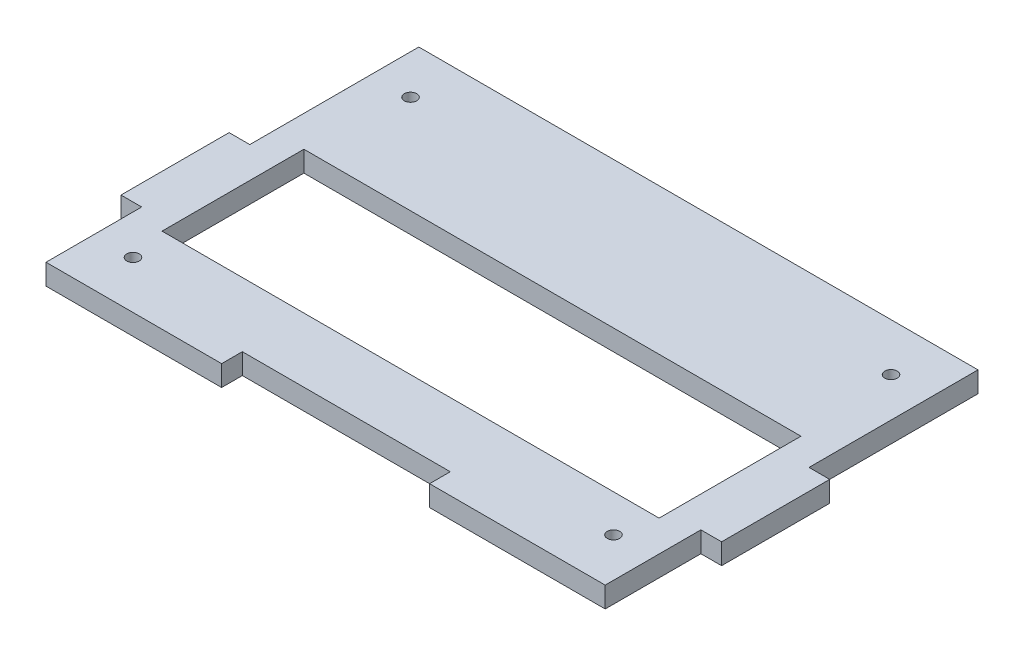
ISO-10303-21;
HEADER;
FILE_DESCRIPTION(('STEP AP214'),'2;1');
FILE_NAME('part.step','',(''),(''),'','','');
FILE_SCHEMA(('AUTOMOTIVE_DESIGN { 1 0 10303 214 1 1 1 1 }'));
ENDSEC;
DATA;
#1=APPLICATION_CONTEXT('core data for automotive mechanical design processes');
#2=APPLICATION_PROTOCOL_DEFINITION('international standard','automotive_design',2000,#1);
#3=PRODUCT_CONTEXT('',#1,'mechanical');
#4=PRODUCT('Part','Part','',(#3));
#5=PRODUCT_RELATED_PRODUCT_CATEGORY('part','',(#4));
#6=PRODUCT_DEFINITION_FORMATION('','',#4);
#7=PRODUCT_DEFINITION_CONTEXT('part definition',#1,'design');
#8=PRODUCT_DEFINITION('design','',#6,#7);
#9=PRODUCT_DEFINITION_SHAPE('','',#8);
#10=(LENGTH_UNIT() NAMED_UNIT(*) SI_UNIT(.MILLI.,.METRE.));
#11=(NAMED_UNIT(*) PLANE_ANGLE_UNIT() SI_UNIT($,.RADIAN.));
#12=(NAMED_UNIT(*) SI_UNIT($,.STERADIAN.) SOLID_ANGLE_UNIT());
#13=UNCERTAINTY_MEASURE_WITH_UNIT(LENGTH_MEASURE(1.E-05),#10,'distance_accuracy_value','');
#14=(GEOMETRIC_REPRESENTATION_CONTEXT(3) GLOBAL_UNCERTAINTY_ASSIGNED_CONTEXT((#13)) GLOBAL_UNIT_ASSIGNED_CONTEXT((#10,
#11,#12)) REPRESENTATION_CONTEXT('',''));
#15=CARTESIAN_POINT('',(0.,0.,0.));
#16=DIRECTION('',(0.,0.,1.));
#17=DIRECTION('',(1.,0.,0.));
#18=AXIS2_PLACEMENT_3D('',#15,#16,#17);
#19=CARTESIAN_POINT('',(-72.5,5.,45.));
#20=DIRECTION('',(0.,0.,-1.));
#21=DIRECTION('',(-1.,0.,0.));
#22=AXIS2_PLACEMENT_3D('',#19,#20,#21);
#23=PLANE('',#22);
#24=DIRECTION('',(0.,1.,0.));
#25=VECTOR('',#24,1.);
#26=CARTESIAN_POINT('',(25.1,0.,45.));
#27=LINE('',#26,#25);
#28=CARTESIAN_POINT('',(25.1,0.,45.));
#29=VERTEX_POINT('',#28);
#30=CARTESIAN_POINT('',(25.1,5.,45.));
#31=VERTEX_POINT('',#30);
#32=EDGE_CURVE('E209',#29,#31,#27,.T.);
#33=ORIENTED_EDGE('',*,*,#32,.F.);
#34=DIRECTION('',(1.,0.,0.));
#35=VECTOR('',#34,1.);
#36=CARTESIAN_POINT('',(-72.5,0.,45.));
#37=LINE('',#36,#35);
#38=CARTESIAN_POINT('',(67.5,0.,45.));
#39=VERTEX_POINT('',#38);
#40=EDGE_CURVE('E196',#29,#39,#37,.T.);
#41=ORIENTED_EDGE('',*,*,#40,.T.);
#42=DIRECTION('',(0.,1.,0.));
#43=VECTOR('',#42,1.);
#44=CARTESIAN_POINT('',(67.5,0.,45.));
#45=LINE('',#44,#43);
#46=CARTESIAN_POINT('',(67.5,5.,45.));
#47=VERTEX_POINT('',#46);
#48=EDGE_CURVE('E242',#39,#47,#45,.T.);
#49=ORIENTED_EDGE('',*,*,#48,.T.);
#50=DIRECTION('',(1.,0.,0.));
#51=VECTOR('',#50,1.);
#52=CARTESIAN_POINT('',(-72.5,5.,45.));
#53=LINE('',#52,#51);
#54=EDGE_CURVE('E48',#31,#47,#53,.T.);
#55=ORIENTED_EDGE('',*,*,#54,.F.);
#56=EDGE_LOOP('',(#33,#41,#49,#55));
#57=FACE_BOUND('',#56,.T.);
#58=ADVANCED_FACE('F39',(#57),#23,.F.);
#59=CARTESIAN_POINT('',(0.,5.,0.));
#60=DIRECTION('',(0.,-1.,0.));
#61=DIRECTION('',(0.,0.,-1.));
#62=AXIS2_PLACEMENT_3D('',#59,#60,#61);
#63=PLANE('',#62);
#64=CARTESIAN_POINT('',(-58.,5.,33.5));
#65=DIRECTION('',(0.,1.,0.));
#66=DIRECTION('',(0.,0.,1.));
#67=AXIS2_PLACEMENT_3D('',#64,#65,#66);
#68=CIRCLE('',#67,1.5);
#69=CARTESIAN_POINT('',(-58.,5.,35.));
#70=VERTEX_POINT('',#69);
#71=EDGE_CURVE('E644',#70,#70,#68,.T.);
#72=ORIENTED_EDGE('',*,*,#71,.F.);
#73=EDGE_LOOP('',(#72));
#74=FACE_BOUND('',#73,.T.);
#75=CARTESIAN_POINT('',(58.,5.,33.5));
#76=DIRECTION('',(0.,1.,0.));
#77=DIRECTION('',(0.,0.,1.));
#78=AXIS2_PLACEMENT_3D('',#75,#76,#77);
#79=CIRCLE('',#78,1.5);
#80=CARTESIAN_POINT('',(58.,5.,35.));
#81=VERTEX_POINT('',#80);
#82=EDGE_CURVE('E643',#81,#81,#79,.T.);
#83=ORIENTED_EDGE('',*,*,#82,.F.);
#84=EDGE_LOOP('',(#83));
#85=FACE_BOUND('',#84,.T.);
#86=CARTESIAN_POINT('',(58.,5.,-33.5));
#87=DIRECTION('',(0.,1.,0.));
#88=DIRECTION('',(0.,0.,1.));
#89=AXIS2_PLACEMENT_3D('',#86,#87,#88);
#90=CIRCLE('',#89,1.5);
#91=CARTESIAN_POINT('',(58.,5.,-32.));
#92=VERTEX_POINT('',#91);
#93=EDGE_CURVE('E641',#92,#92,#90,.T.);
#94=ORIENTED_EDGE('',*,*,#93,.F.);
#95=EDGE_LOOP('',(#94));
#96=FACE_BOUND('',#95,.T.);
#97=CARTESIAN_POINT('',(-58.,5.,-33.5));
#98=DIRECTION('',(0.,1.,0.));
#99=DIRECTION('',(0.,0.,1.));
#100=AXIS2_PLACEMENT_3D('',#97,#98,#99);
#101=CIRCLE('',#100,1.5);
#102=CARTESIAN_POINT('',(-58.,5.,-32.));
#103=VERTEX_POINT('',#102);
#104=EDGE_CURVE('E204',#103,#103,#101,.T.);
#105=ORIENTED_EDGE('',*,*,#104,.F.);
#106=EDGE_LOOP('',(#105));
#107=FACE_BOUND('',#106,.T.);
#108=DIRECTION('',(-1.,0.,0.));
#109=VECTOR('',#108,1.);
#110=CARTESIAN_POINT('',(-60.,5.,-9.76000000000001));
#111=LINE('',#110,#109);
#112=CARTESIAN_POINT('',(60.,5.,-9.76000000000001));
#113=VERTEX_POINT('',#112);
#114=CARTESIAN_POINT('',(-60.,5.,-9.76000000000001));
#115=VERTEX_POINT('',#114);
#116=EDGE_CURVE('E301',#113,#115,#111,.T.);
#117=ORIENTED_EDGE('',*,*,#116,.F.);
#118=DIRECTION('',(0.,0.,-1.));
#119=VECTOR('',#118,1.);
#120=CARTESIAN_POINT('',(60.,5.,24.49));
#121=LINE('',#120,#119);
#122=CARTESIAN_POINT('',(60.,5.,24.49));
#123=VERTEX_POINT('',#122);
#124=EDGE_CURVE('E284',#123,#113,#121,.T.);
#125=ORIENTED_EDGE('',*,*,#124,.F.);
#126=DIRECTION('',(1.,0.,0.));
#127=VECTOR('',#126,1.);
#128=CARTESIAN_POINT('',(-60.,5.,24.49));
#129=LINE('',#128,#127);
#130=CARTESIAN_POINT('',(-60.,5.,24.49));
#131=VERTEX_POINT('',#130);
#132=EDGE_CURVE('E292',#131,#123,#129,.T.);
#133=ORIENTED_EDGE('',*,*,#132,.F.);
#134=DIRECTION('',(0.,0.,1.));
#135=VECTOR('',#134,1.);
#136=CARTESIAN_POINT('',(-60.,5.,24.49));
#137=LINE('',#136,#135);
#138=EDGE_CURVE('E302',#115,#131,#137,.T.);
#139=ORIENTED_EDGE('',*,*,#138,.F.);
#140=EDGE_LOOP('',(#117,#125,#133,#139));
#141=FACE_BOUND('',#140,.T.);
#142=DIRECTION('',(0.,0.,-1.));
#143=VECTOR('',#142,1.);
#144=CARTESIAN_POINT('',(25.1,5.,40.));
#145=LINE('',#144,#143);
#146=CARTESIAN_POINT('',(25.1,5.,40.));
#147=VERTEX_POINT('',#146);
#148=EDGE_CURVE('E184',#31,#147,#145,.T.);
#149=ORIENTED_EDGE('',*,*,#148,.F.);
#150=ORIENTED_EDGE('',*,*,#54,.T.);
#151=DIRECTION('',(0.,0.,1.));
#152=VECTOR('',#151,1.);
#153=CARTESIAN_POINT('',(67.5,5.,45.));
#154=LINE('',#153,#152);
#155=CARTESIAN_POINT('',(67.5,5.,21.9));
#156=VERTEX_POINT('',#155);
#157=EDGE_CURVE('E249',#156,#47,#154,.T.);
#158=ORIENTED_EDGE('',*,*,#157,.F.);
#159=DIRECTION('',(-1.,0.,0.));
#160=VECTOR('',#159,1.);
#161=CARTESIAN_POINT('',(72.5,5.,21.9));
#162=LINE('',#161,#160);
#163=CARTESIAN_POINT('',(72.5,5.,21.9));
#164=VERTEX_POINT('',#163);
#165=EDGE_CURVE('E223',#164,#156,#162,.T.);
#166=ORIENTED_EDGE('',*,*,#165,.F.);
#167=DIRECTION('',(0.,0.,-1.));
#168=VECTOR('',#167,1.);
#169=CARTESIAN_POINT('',(72.5,5.,45.));
#170=LINE('',#169,#168);
#171=CARTESIAN_POINT('',(72.5,5.,-4.2));
#172=VERTEX_POINT('',#171);
#173=EDGE_CURVE('E317',#164,#172,#170,.T.);
#174=ORIENTED_EDGE('',*,*,#173,.T.);
#175=DIRECTION('',(1.,0.,0.));
#176=VECTOR('',#175,1.);
#177=CARTESIAN_POINT('',(72.5,5.,-4.2));
#178=LINE('',#177,#176);
#179=CARTESIAN_POINT('',(67.5,5.,-4.2));
#180=VERTEX_POINT('',#179);
#181=EDGE_CURVE('E261',#180,#172,#178,.T.);
#182=ORIENTED_EDGE('',*,*,#181,.F.);
#183=DIRECTION('',(0.,0.,1.));
#184=VECTOR('',#183,1.);
#185=CARTESIAN_POINT('',(67.5,5.,-45.));
#186=LINE('',#185,#184);
#187=CARTESIAN_POINT('',(67.5,5.,-45.));
#188=VERTEX_POINT('',#187);
#189=EDGE_CURVE('E245',#188,#180,#186,.T.);
#190=ORIENTED_EDGE('',*,*,#189,.F.);
#191=DIRECTION('',(-1.,0.,0.));
#192=VECTOR('',#191,1.);
#193=CARTESIAN_POINT('',(-72.5,5.,-45.));
#194=LINE('',#193,#192);
#195=CARTESIAN_POINT('',(-67.5,5.,-45.));
#196=VERTEX_POINT('',#195);
#197=EDGE_CURVE('E325',#188,#196,#194,.T.);
#198=ORIENTED_EDGE('',*,*,#197,.T.);
#199=DIRECTION('',(0.,0.,-1.));
#200=VECTOR('',#199,1.);
#201=CARTESIAN_POINT('',(-67.5,5.,-45.));
#202=LINE('',#201,#200);
#203=CARTESIAN_POINT('',(-67.5,5.,-4.2));
#204=VERTEX_POINT('',#203);
#205=EDGE_CURVE('E272',#204,#196,#202,.T.);
#206=ORIENTED_EDGE('',*,*,#205,.F.);
#207=DIRECTION('',(1.,0.,0.));
#208=VECTOR('',#207,1.);
#209=CARTESIAN_POINT('',(-72.5,5.,-4.2));
#210=LINE('',#209,#208);
#211=CARTESIAN_POINT('',(-72.5,5.,-4.2));
#212=VERTEX_POINT('',#211);
#213=EDGE_CURVE('E231',#212,#204,#210,.T.);
#214=ORIENTED_EDGE('',*,*,#213,.F.);
#215=DIRECTION('',(0.,0.,1.));
#216=VECTOR('',#215,1.);
#217=CARTESIAN_POINT('',(-72.5,5.,45.));
#218=LINE('',#217,#216);
#219=CARTESIAN_POINT('',(-72.5,5.,21.9));
#220=VERTEX_POINT('',#219);
#221=EDGE_CURVE('E326',#212,#220,#218,.T.);
#222=ORIENTED_EDGE('',*,*,#221,.T.);
#223=DIRECTION('',(-1.,0.,0.));
#224=VECTOR('',#223,1.);
#225=CARTESIAN_POINT('',(-72.5,5.,21.9));
#226=LINE('',#225,#224);
#227=CARTESIAN_POINT('',(-67.5,5.,21.9));
#228=VERTEX_POINT('',#227);
#229=EDGE_CURVE('E226',#228,#220,#226,.T.);
#230=ORIENTED_EDGE('',*,*,#229,.F.);
#231=DIRECTION('',(0.,0.,-1.));
#232=VECTOR('',#231,1.);
#233=CARTESIAN_POINT('',(-67.5,5.,45.));
#234=LINE('',#233,#232);
#235=CARTESIAN_POINT('',(-67.5,5.,45.));
#236=VERTEX_POINT('',#235);
#237=EDGE_CURVE('E229',#236,#228,#234,.T.);
#238=ORIENTED_EDGE('',*,*,#237,.F.);
#239=CARTESIAN_POINT('',(-25.1,5.,45.));
#240=VERTEX_POINT('',#239);
#241=EDGE_CURVE('E11',#236,#240,#53,.T.);
#242=ORIENTED_EDGE('',*,*,#241,.T.);
#243=DIRECTION('',(0.,0.,1.));
#244=VECTOR('',#243,1.);
#245=CARTESIAN_POINT('',(-25.1,5.,40.));
#246=LINE('',#245,#244);
#247=CARTESIAN_POINT('',(-25.1,5.,40.));
#248=VERTEX_POINT('',#247);
#249=EDGE_CURVE('E200',#248,#240,#246,.T.);
#250=ORIENTED_EDGE('',*,*,#249,.F.);
#251=DIRECTION('',(-1.,0.,0.));
#252=VECTOR('',#251,1.);
#253=CARTESIAN_POINT('',(-25.1,5.,40.));
#254=LINE('',#253,#252);
#255=EDGE_CURVE('E203',#147,#248,#254,.T.);
#256=ORIENTED_EDGE('',*,*,#255,.F.);
#257=EDGE_LOOP('',(#149,#150,#158,#166,#174,#182,#190,#198,#206,#214,#222,#230,#238,#242,#250,#256));
#258=FACE_BOUND('',#257,.T.);
#259=ADVANCED_FACE('F359',(#74,#85,#96,#107,#141,#258),#63,.F.);
#260=CARTESIAN_POINT('',(0.,0.,0.));
#261=DIRECTION('',(0.,-1.,0.));
#262=DIRECTION('',(0.,0.,-1.));
#263=AXIS2_PLACEMENT_3D('',#260,#261,#262);
#264=PLANE('',#263);
#265=CARTESIAN_POINT('',(-58.,0.,33.5));
#266=DIRECTION('',(0.,-1.,0.));
#267=DIRECTION('',(0.,0.,-1.));
#268=AXIS2_PLACEMENT_3D('',#265,#266,#267);
#269=CIRCLE('',#268,1.5);
#270=CARTESIAN_POINT('',(-58.,0.,32.));
#271=VERTEX_POINT('',#270);
#272=EDGE_CURVE('E43',#271,#271,#269,.T.);
#273=ORIENTED_EDGE('',*,*,#272,.F.);
#274=EDGE_LOOP('',(#273));
#275=FACE_BOUND('',#274,.T.);
#276=CARTESIAN_POINT('',(58.,0.,33.5));
#277=DIRECTION('',(0.,-1.,0.));
#278=DIRECTION('',(0.,0.,-1.));
#279=AXIS2_PLACEMENT_3D('',#276,#277,#278);
#280=CIRCLE('',#279,1.5);
#281=CARTESIAN_POINT('',(58.,0.,32.));
#282=VERTEX_POINT('',#281);
#283=EDGE_CURVE('E343',#282,#282,#280,.T.);
#284=ORIENTED_EDGE('',*,*,#283,.F.);
#285=EDGE_LOOP('',(#284));
#286=FACE_BOUND('',#285,.T.);
#287=CARTESIAN_POINT('',(58.,0.,-33.5));
#288=DIRECTION('',(0.,-1.,0.));
#289=DIRECTION('',(0.,0.,-1.));
#290=AXIS2_PLACEMENT_3D('',#287,#288,#289);
#291=CIRCLE('',#290,1.5);
#292=CARTESIAN_POINT('',(58.,0.,-35.));
#293=VERTEX_POINT('',#292);
#294=EDGE_CURVE('E341',#293,#293,#291,.T.);
#295=ORIENTED_EDGE('',*,*,#294,.F.);
#296=EDGE_LOOP('',(#295));
#297=FACE_BOUND('',#296,.T.);
#298=CARTESIAN_POINT('',(-58.,0.,-33.5));
#299=DIRECTION('',(0.,-1.,0.));
#300=DIRECTION('',(0.,0.,-1.));
#301=AXIS2_PLACEMENT_3D('',#298,#299,#300);
#302=CIRCLE('',#301,1.5);
#303=CARTESIAN_POINT('',(-58.,0.,-35.));
#304=VERTEX_POINT('',#303);
#305=EDGE_CURVE('E338',#304,#304,#302,.T.);
#306=ORIENTED_EDGE('',*,*,#305,.F.);
#307=EDGE_LOOP('',(#306));
#308=FACE_BOUND('',#307,.T.);
#309=DIRECTION('',(0.,0.,-1.));
#310=VECTOR('',#309,1.);
#311=CARTESIAN_POINT('',(60.,0.,24.49));
#312=LINE('',#311,#310);
#313=CARTESIAN_POINT('',(60.,0.,24.49));
#314=VERTEX_POINT('',#313);
#315=CARTESIAN_POINT('',(60.,0.,-9.76000000000001));
#316=VERTEX_POINT('',#315);
#317=EDGE_CURVE('E286',#314,#316,#312,.T.);
#318=ORIENTED_EDGE('',*,*,#317,.T.);
#319=DIRECTION('',(-1.,0.,0.));
#320=VECTOR('',#319,1.);
#321=CARTESIAN_POINT('',(-60.,0.,-9.76000000000001));
#322=LINE('',#321,#320);
#323=CARTESIAN_POINT('',(-60.,0.,-9.76000000000001));
#324=VERTEX_POINT('',#323);
#325=EDGE_CURVE('E287',#316,#324,#322,.T.);
#326=ORIENTED_EDGE('',*,*,#325,.T.);
#327=DIRECTION('',(0.,0.,1.));
#328=VECTOR('',#327,1.);
#329=CARTESIAN_POINT('',(-60.,0.,24.49));
#330=LINE('',#329,#328);
#331=CARTESIAN_POINT('',(-60.,0.,24.49));
#332=VERTEX_POINT('',#331);
#333=EDGE_CURVE('E294',#324,#332,#330,.T.);
#334=ORIENTED_EDGE('',*,*,#333,.T.);
#335=DIRECTION('',(1.,0.,0.));
#336=VECTOR('',#335,1.);
#337=CARTESIAN_POINT('',(-60.,0.,24.49));
#338=LINE('',#337,#336);
#339=EDGE_CURVE('E297',#332,#314,#338,.T.);
#340=ORIENTED_EDGE('',*,*,#339,.T.);
#341=EDGE_LOOP('',(#318,#326,#334,#340));
#342=FACE_BOUND('',#341,.T.);
#343=ORIENTED_EDGE('',*,*,#40,.F.);
#344=DIRECTION('',(0.,0.,-1.));
#345=VECTOR('',#344,1.);
#346=CARTESIAN_POINT('',(25.1,0.,40.));
#347=LINE('',#346,#345);
#348=CARTESIAN_POINT('',(25.1,0.,40.));
#349=VERTEX_POINT('',#348);
#350=EDGE_CURVE('E182',#29,#349,#347,.T.);
#351=ORIENTED_EDGE('',*,*,#350,.T.);
#352=DIRECTION('',(-1.,0.,0.));
#353=VECTOR('',#352,1.);
#354=CARTESIAN_POINT('',(-25.1,0.,40.));
#355=LINE('',#354,#353);
#356=CARTESIAN_POINT('',(-25.1,0.,40.));
#357=VERTEX_POINT('',#356);
#358=EDGE_CURVE('E194',#349,#357,#355,.T.);
#359=ORIENTED_EDGE('',*,*,#358,.T.);
#360=DIRECTION('',(0.,0.,1.));
#361=VECTOR('',#360,1.);
#362=CARTESIAN_POINT('',(-25.1,0.,40.));
#363=LINE('',#362,#361);
#364=CARTESIAN_POINT('',(-25.1,0.,45.));
#365=VERTEX_POINT('',#364);
#366=EDGE_CURVE('E57',#357,#365,#363,.T.);
#367=ORIENTED_EDGE('',*,*,#366,.T.);
#368=CARTESIAN_POINT('',(-67.5,0.,45.));
#369=VERTEX_POINT('',#368);
#370=EDGE_CURVE('E323',#369,#365,#37,.T.);
#371=ORIENTED_EDGE('',*,*,#370,.F.);
#372=DIRECTION('',(0.,0.,-1.));
#373=VECTOR('',#372,1.);
#374=CARTESIAN_POINT('',(-67.5,0.,45.));
#375=LINE('',#374,#373);
#376=CARTESIAN_POINT('',(-67.5,0.,21.9));
#377=VERTEX_POINT('',#376);
#378=EDGE_CURVE('E228',#369,#377,#375,.T.);
#379=ORIENTED_EDGE('',*,*,#378,.T.);
#380=DIRECTION('',(-1.,0.,0.));
#381=VECTOR('',#380,1.);
#382=CARTESIAN_POINT('',(-72.5,0.,21.9));
#383=LINE('',#382,#381);
#384=CARTESIAN_POINT('',(-72.5,0.,21.9));
#385=VERTEX_POINT('',#384);
#386=EDGE_CURVE('E218',#377,#385,#383,.T.);
#387=ORIENTED_EDGE('',*,*,#386,.T.);
#388=DIRECTION('',(0.,0.,1.));
#389=VECTOR('',#388,1.);
#390=CARTESIAN_POINT('',(-72.5,0.,45.));
#391=LINE('',#390,#389);
#392=CARTESIAN_POINT('',(-72.5,0.,-4.2));
#393=VERTEX_POINT('',#392);
#394=EDGE_CURVE('E331',#393,#385,#391,.T.);
#395=ORIENTED_EDGE('',*,*,#394,.F.);
#396=DIRECTION('',(1.,0.,0.));
#397=VECTOR('',#396,1.);
#398=CARTESIAN_POINT('',(-72.5,0.,-4.2));
#399=LINE('',#398,#397);
#400=CARTESIAN_POINT('',(-67.5,0.,-4.2));
#401=VERTEX_POINT('',#400);
#402=EDGE_CURVE('E267',#393,#401,#399,.T.);
#403=ORIENTED_EDGE('',*,*,#402,.T.);
#404=DIRECTION('',(0.,0.,-1.));
#405=VECTOR('',#404,1.);
#406=CARTESIAN_POINT('',(-67.5,0.,-45.));
#407=LINE('',#406,#405);
#408=CARTESIAN_POINT('',(-67.5,0.,-45.));
#409=VERTEX_POINT('',#408);
#410=EDGE_CURVE('E275',#401,#409,#407,.T.);
#411=ORIENTED_EDGE('',*,*,#410,.T.);
#412=DIRECTION('',(-1.,0.,0.));
#413=VECTOR('',#412,1.);
#414=CARTESIAN_POINT('',(-72.5,0.,-45.));
#415=LINE('',#414,#413);
#416=CARTESIAN_POINT('',(67.5,0.,-45.));
#417=VERTEX_POINT('',#416);
#418=EDGE_CURVE('E332',#417,#409,#415,.T.);
#419=ORIENTED_EDGE('',*,*,#418,.F.);
#420=DIRECTION('',(0.,0.,1.));
#421=VECTOR('',#420,1.);
#422=CARTESIAN_POINT('',(67.5,0.,-45.));
#423=LINE('',#422,#421);
#424=CARTESIAN_POINT('',(67.5,0.,-4.2));
#425=VERTEX_POINT('',#424);
#426=EDGE_CURVE('E263',#417,#425,#423,.T.);
#427=ORIENTED_EDGE('',*,*,#426,.T.);
#428=DIRECTION('',(1.,0.,0.));
#429=VECTOR('',#428,1.);
#430=CARTESIAN_POINT('',(72.5,0.,-4.2));
#431=LINE('',#430,#429);
#432=CARTESIAN_POINT('',(72.5,0.,-4.2));
#433=VERTEX_POINT('',#432);
#434=EDGE_CURVE('E63',#425,#433,#431,.T.);
#435=ORIENTED_EDGE('',*,*,#434,.T.);
#436=DIRECTION('',(0.,0.,-1.));
#437=VECTOR('',#436,1.);
#438=CARTESIAN_POINT('',(72.5,0.,45.));
#439=LINE('',#438,#437);
#440=CARTESIAN_POINT('',(72.5,0.,21.9));
#441=VERTEX_POINT('',#440);
#442=EDGE_CURVE('E315',#441,#433,#439,.T.);
#443=ORIENTED_EDGE('',*,*,#442,.F.);
#444=DIRECTION('',(-1.,0.,0.));
#445=VECTOR('',#444,1.);
#446=CARTESIAN_POINT('',(72.5,0.,21.9));
#447=LINE('',#446,#445);
#448=CARTESIAN_POINT('',(67.5,0.,21.9));
#449=VERTEX_POINT('',#448);
#450=EDGE_CURVE('E248',#441,#449,#447,.T.);
#451=ORIENTED_EDGE('',*,*,#450,.T.);
#452=DIRECTION('',(0.,0.,1.));
#453=VECTOR('',#452,1.);
#454=CARTESIAN_POINT('',(67.5,0.,45.));
#455=LINE('',#454,#453);
#456=EDGE_CURVE('E239',#449,#39,#455,.T.);
#457=ORIENTED_EDGE('',*,*,#456,.T.);
#458=EDGE_LOOP('',(#343,#351,#359,#367,#371,#379,#387,#395,#403,#411,#419,#427,#435,#443,#451,#457));
#459=FACE_BOUND('',#458,.T.);
#460=ADVANCED_FACE('F198',(#275,#286,#297,#308,#342,#459),#264,.T.);
#461=CARTESIAN_POINT('',(72.5,5.,45.));
#462=DIRECTION('',(-1.,0.,0.));
#463=DIRECTION('',(0.,0.,1.));
#464=AXIS2_PLACEMENT_3D('',#461,#462,#463);
#465=PLANE('',#464);
#466=ORIENTED_EDGE('',*,*,#442,.T.);
#467=DIRECTION('',(0.,1.,0.));
#468=VECTOR('',#467,1.);
#469=CARTESIAN_POINT('',(72.5,0.,-4.2));
#470=LINE('',#469,#468);
#471=EDGE_CURVE('E215',#433,#172,#470,.T.);
#472=ORIENTED_EDGE('',*,*,#471,.T.);
#473=ORIENTED_EDGE('',*,*,#173,.F.);
#474=DIRECTION('',(0.,1.,0.));
#475=VECTOR('',#474,1.);
#476=CARTESIAN_POINT('',(72.5,0.,21.9));
#477=LINE('',#476,#475);
#478=EDGE_CURVE('E240',#441,#164,#477,.T.);
#479=ORIENTED_EDGE('',*,*,#478,.F.);
#480=EDGE_LOOP('',(#466,#472,#473,#479));
#481=FACE_BOUND('',#480,.T.);
#482=ADVANCED_FACE('F41',(#481),#465,.F.);
#483=CARTESIAN_POINT('',(-72.5,5.,-45.));
#484=DIRECTION('',(0.,0.,1.));
#485=DIRECTION('',(1.,0.,0.));
#486=AXIS2_PLACEMENT_3D('',#483,#484,#485);
#487=PLANE('',#486);
#488=DIRECTION('',(0.,1.,0.));
#489=VECTOR('',#488,1.);
#490=CARTESIAN_POINT('',(67.5,0.,-45.));
#491=LINE('',#490,#489);
#492=EDGE_CURVE('E254',#417,#188,#491,.T.);
#493=ORIENTED_EDGE('',*,*,#492,.F.);
#494=ORIENTED_EDGE('',*,*,#418,.T.);
#495=DIRECTION('',(0.,1.,0.));
#496=VECTOR('',#495,1.);
#497=CARTESIAN_POINT('',(-67.5,0.,-45.));
#498=LINE('',#497,#496);
#499=EDGE_CURVE('E278',#409,#196,#498,.T.);
#500=ORIENTED_EDGE('',*,*,#499,.T.);
#501=ORIENTED_EDGE('',*,*,#197,.F.);
#502=EDGE_LOOP('',(#493,#494,#500,#501));
#503=FACE_BOUND('',#502,.T.);
#504=ADVANCED_FACE('F409',(#503),#487,.F.);
#505=CARTESIAN_POINT('',(-72.5,5.,45.));
#506=DIRECTION('',(1.,0.,0.));
#507=DIRECTION('',(0.,0.,-1.));
#508=AXIS2_PLACEMENT_3D('',#505,#506,#507);
#509=PLANE('',#508);
#510=ORIENTED_EDGE('',*,*,#394,.T.);
#511=DIRECTION('',(0.,1.,0.));
#512=VECTOR('',#511,1.);
#513=CARTESIAN_POINT('',(-72.5,0.,21.9));
#514=LINE('',#513,#512);
#515=EDGE_CURVE('E225',#385,#220,#514,.T.);
#516=ORIENTED_EDGE('',*,*,#515,.T.);
#517=ORIENTED_EDGE('',*,*,#221,.F.);
#518=DIRECTION('',(0.,1.,0.));
#519=VECTOR('',#518,1.);
#520=CARTESIAN_POINT('',(-72.5,0.,-4.2));
#521=LINE('',#520,#519);
#522=EDGE_CURVE('E277',#393,#212,#521,.T.);
#523=ORIENTED_EDGE('',*,*,#522,.F.);
#524=EDGE_LOOP('',(#510,#516,#517,#523));
#525=FACE_BOUND('',#524,.T.);
#526=ADVANCED_FACE('F423',(#525),#509,.F.);
#527=ORIENTED_EDGE('',*,*,#370,.T.);
#528=DIRECTION('',(0.,1.,0.));
#529=VECTOR('',#528,1.);
#530=CARTESIAN_POINT('',(-25.1,0.,45.));
#531=LINE('',#530,#529);
#532=EDGE_CURVE('E213',#365,#240,#531,.T.);
#533=ORIENTED_EDGE('',*,*,#532,.T.);
#534=ORIENTED_EDGE('',*,*,#241,.F.);
#535=DIRECTION('',(0.,1.,0.));
#536=VECTOR('',#535,1.);
#537=CARTESIAN_POINT('',(-67.5,0.,45.));
#538=LINE('',#537,#536);
#539=EDGE_CURVE('E220',#369,#236,#538,.T.);
#540=ORIENTED_EDGE('',*,*,#539,.F.);
#541=EDGE_LOOP('',(#527,#533,#534,#540));
#542=FACE_BOUND('',#541,.T.);
#543=ADVANCED_FACE('F435',(#542),#23,.F.);
#544=CARTESIAN_POINT('',(60.,0.,24.49));
#545=DIRECTION('',(1.,0.,0.));
#546=DIRECTION('',(0.,0.,-1.));
#547=AXIS2_PLACEMENT_3D('',#544,#545,#546);
#548=PLANE('',#547);
#549=ORIENTED_EDGE('',*,*,#124,.T.);
#550=DIRECTION('',(0.,1.,0.));
#551=VECTOR('',#550,1.);
#552=CARTESIAN_POINT('',(60.,0.,-9.76000000000001));
#553=LINE('',#552,#551);
#554=EDGE_CURVE('E300',#316,#113,#553,.T.);
#555=ORIENTED_EDGE('',*,*,#554,.F.);
#556=ORIENTED_EDGE('',*,*,#317,.F.);
#557=DIRECTION('',(0.,1.,0.));
#558=VECTOR('',#557,1.);
#559=CARTESIAN_POINT('',(60.,0.,24.49));
#560=LINE('',#559,#558);
#561=EDGE_CURVE('E309',#314,#123,#560,.T.);
#562=ORIENTED_EDGE('',*,*,#561,.T.);
#563=EDGE_LOOP('',(#549,#555,#556,#562));
#564=FACE_BOUND('',#563,.T.);
#565=ADVANCED_FACE('F370',(#564),#548,.F.);
#566=CARTESIAN_POINT('',(-60.,0.,24.49));
#567=DIRECTION('',(0.,0.,1.));
#568=DIRECTION('',(1.,0.,0.));
#569=AXIS2_PLACEMENT_3D('',#566,#567,#568);
#570=PLANE('',#569);
#571=ORIENTED_EDGE('',*,*,#132,.T.);
#572=ORIENTED_EDGE('',*,*,#561,.F.);
#573=ORIENTED_EDGE('',*,*,#339,.F.);
#574=DIRECTION('',(0.,1.,0.));
#575=VECTOR('',#574,1.);
#576=CARTESIAN_POINT('',(-60.,0.,24.49));
#577=LINE('',#576,#575);
#578=EDGE_CURVE('E311',#332,#131,#577,.T.);
#579=ORIENTED_EDGE('',*,*,#578,.T.);
#580=EDGE_LOOP('',(#571,#572,#573,#579));
#581=FACE_BOUND('',#580,.T.);
#582=ADVANCED_FACE('F378',(#581),#570,.F.);
#583=CARTESIAN_POINT('',(-60.,0.,24.49));
#584=DIRECTION('',(-1.,0.,0.));
#585=DIRECTION('',(0.,0.,1.));
#586=AXIS2_PLACEMENT_3D('',#583,#584,#585);
#587=PLANE('',#586);
#588=ORIENTED_EDGE('',*,*,#138,.T.);
#589=ORIENTED_EDGE('',*,*,#578,.F.);
#590=ORIENTED_EDGE('',*,*,#333,.F.);
#591=DIRECTION('',(0.,1.,0.));
#592=VECTOR('',#591,1.);
#593=CARTESIAN_POINT('',(-60.,0.,-9.76000000000001));
#594=LINE('',#593,#592);
#595=EDGE_CURVE('E312',#324,#115,#594,.T.);
#596=ORIENTED_EDGE('',*,*,#595,.T.);
#597=EDGE_LOOP('',(#588,#589,#590,#596));
#598=FACE_BOUND('',#597,.T.);
#599=ADVANCED_FACE('F374',(#598),#587,.F.);
#600=CARTESIAN_POINT('',(-60.,0.,-9.76000000000001));
#601=DIRECTION('',(0.,0.,-1.));
#602=DIRECTION('',(-1.,0.,0.));
#603=AXIS2_PLACEMENT_3D('',#600,#601,#602);
#604=PLANE('',#603);
#605=ORIENTED_EDGE('',*,*,#116,.T.);
#606=ORIENTED_EDGE('',*,*,#595,.F.);
#607=ORIENTED_EDGE('',*,*,#325,.F.);
#608=ORIENTED_EDGE('',*,*,#554,.T.);
#609=EDGE_LOOP('',(#605,#606,#607,#608));
#610=FACE_BOUND('',#609,.T.);
#611=ADVANCED_FACE('F375',(#610),#604,.F.);
#612=CARTESIAN_POINT('',(-67.5,0.,-45.));
#613=DIRECTION('',(1.,0.,0.));
#614=DIRECTION('',(0.,0.,-1.));
#615=AXIS2_PLACEMENT_3D('',#612,#613,#614);
#616=PLANE('',#615);
#617=ORIENTED_EDGE('',*,*,#205,.T.);
#618=ORIENTED_EDGE('',*,*,#499,.F.);
#619=ORIENTED_EDGE('',*,*,#410,.F.);
#620=DIRECTION('',(0.,1.,0.));
#621=VECTOR('',#620,1.);
#622=CARTESIAN_POINT('',(-67.5,0.,-4.2));
#623=LINE('',#622,#621);
#624=EDGE_CURVE('E283',#401,#204,#623,.T.);
#625=ORIENTED_EDGE('',*,*,#624,.T.);
#626=EDGE_LOOP('',(#617,#618,#619,#625));
#627=FACE_BOUND('',#626,.T.);
#628=ADVANCED_FACE('F411',(#627),#616,.F.);
#629=CARTESIAN_POINT('',(-72.5,0.,-4.2));
#630=DIRECTION('',(0.,0.,1.));
#631=DIRECTION('',(1.,0.,0.));
#632=AXIS2_PLACEMENT_3D('',#629,#630,#631);
#633=PLANE('',#632);
#634=ORIENTED_EDGE('',*,*,#213,.T.);
#635=ORIENTED_EDGE('',*,*,#624,.F.);
#636=ORIENTED_EDGE('',*,*,#402,.F.);
#637=ORIENTED_EDGE('',*,*,#522,.T.);
#638=EDGE_LOOP('',(#634,#635,#636,#637));
#639=FACE_BOUND('',#638,.T.);
#640=ADVANCED_FACE('F413',(#639),#633,.F.);
#641=CARTESIAN_POINT('',(-72.5,0.,21.9));
#642=DIRECTION('',(0.,0.,-1.));
#643=DIRECTION('',(-1.,0.,0.));
#644=AXIS2_PLACEMENT_3D('',#641,#642,#643);
#645=PLANE('',#644);
#646=ORIENTED_EDGE('',*,*,#229,.T.);
#647=ORIENTED_EDGE('',*,*,#515,.F.);
#648=ORIENTED_EDGE('',*,*,#386,.F.);
#649=DIRECTION('',(0.,1.,0.));
#650=VECTOR('',#649,1.);
#651=CARTESIAN_POINT('',(-67.5,0.,21.9));
#652=LINE('',#651,#650);
#653=EDGE_CURVE('E219',#377,#228,#652,.T.);
#654=ORIENTED_EDGE('',*,*,#653,.T.);
#655=EDGE_LOOP('',(#646,#647,#648,#654));
#656=FACE_BOUND('',#655,.T.);
#657=ADVANCED_FACE('F421',(#656),#645,.F.);
#658=CARTESIAN_POINT('',(-67.5,0.,45.));
#659=DIRECTION('',(1.,0.,0.));
#660=DIRECTION('',(0.,0.,-1.));
#661=AXIS2_PLACEMENT_3D('',#658,#659,#660);
#662=PLANE('',#661);
#663=ORIENTED_EDGE('',*,*,#237,.T.);
#664=ORIENTED_EDGE('',*,*,#653,.F.);
#665=ORIENTED_EDGE('',*,*,#378,.F.);
#666=ORIENTED_EDGE('',*,*,#539,.T.);
#667=EDGE_LOOP('',(#663,#664,#665,#666));
#668=FACE_BOUND('',#667,.T.);
#669=ADVANCED_FACE('F428',(#668),#662,.F.);
#670=CARTESIAN_POINT('',(67.5,0.,45.));
#671=DIRECTION('',(-1.,0.,0.));
#672=DIRECTION('',(0.,0.,1.));
#673=AXIS2_PLACEMENT_3D('',#670,#671,#672);
#674=PLANE('',#673);
#675=ORIENTED_EDGE('',*,*,#157,.T.);
#676=ORIENTED_EDGE('',*,*,#48,.F.);
#677=ORIENTED_EDGE('',*,*,#456,.F.);
#678=DIRECTION('',(0.,1.,0.));
#679=VECTOR('',#678,1.);
#680=CARTESIAN_POINT('',(67.5,0.,21.9));
#681=LINE('',#680,#679);
#682=EDGE_CURVE('E238',#449,#156,#681,.T.);
#683=ORIENTED_EDGE('',*,*,#682,.T.);
#684=EDGE_LOOP('',(#675,#676,#677,#683));
#685=FACE_BOUND('',#684,.T.);
#686=ADVANCED_FACE('F388',(#685),#674,.F.);
#687=CARTESIAN_POINT('',(72.5,0.,21.9));
#688=DIRECTION('',(0.,0.,-1.));
#689=DIRECTION('',(-1.,0.,0.));
#690=AXIS2_PLACEMENT_3D('',#687,#688,#689);
#691=PLANE('',#690);
#692=ORIENTED_EDGE('',*,*,#165,.T.);
#693=ORIENTED_EDGE('',*,*,#682,.F.);
#694=ORIENTED_EDGE('',*,*,#450,.F.);
#695=ORIENTED_EDGE('',*,*,#478,.T.);
#696=EDGE_LOOP('',(#692,#693,#694,#695));
#697=FACE_BOUND('',#696,.T.);
#698=ADVANCED_FACE('F395',(#697),#691,.F.);
#699=CARTESIAN_POINT('',(72.5,0.,-4.2));
#700=DIRECTION('',(0.,0.,1.));
#701=DIRECTION('',(1.,0.,0.));
#702=AXIS2_PLACEMENT_3D('',#699,#700,#701);
#703=PLANE('',#702);
#704=ORIENTED_EDGE('',*,*,#181,.T.);
#705=ORIENTED_EDGE('',*,*,#471,.F.);
#706=ORIENTED_EDGE('',*,*,#434,.F.);
#707=DIRECTION('',(0.,1.,0.));
#708=VECTOR('',#707,1.);
#709=CARTESIAN_POINT('',(67.5,0.,-4.2));
#710=LINE('',#709,#708);
#711=EDGE_CURVE('E260',#425,#180,#710,.T.);
#712=ORIENTED_EDGE('',*,*,#711,.T.);
#713=EDGE_LOOP('',(#704,#705,#706,#712));
#714=FACE_BOUND('',#713,.T.);
#715=ADVANCED_FACE('F405',(#714),#703,.F.);
#716=CARTESIAN_POINT('',(67.5,0.,-45.));
#717=DIRECTION('',(-1.,0.,0.));
#718=DIRECTION('',(0.,0.,1.));
#719=AXIS2_PLACEMENT_3D('',#716,#717,#718);
#720=PLANE('',#719);
#721=ORIENTED_EDGE('',*,*,#189,.T.);
#722=ORIENTED_EDGE('',*,*,#711,.F.);
#723=ORIENTED_EDGE('',*,*,#426,.F.);
#724=ORIENTED_EDGE('',*,*,#492,.T.);
#725=EDGE_LOOP('',(#721,#722,#723,#724));
#726=FACE_BOUND('',#725,.T.);
#727=ADVANCED_FACE('F404',(#726),#720,.F.);
#728=CARTESIAN_POINT('',(25.1,0.,40.));
#729=DIRECTION('',(1.,0.,0.));
#730=DIRECTION('',(0.,0.,-1.));
#731=AXIS2_PLACEMENT_3D('',#728,#729,#730);
#732=PLANE('',#731);
#733=ORIENTED_EDGE('',*,*,#148,.T.);
#734=DIRECTION('',(0.,1.,0.));
#735=VECTOR('',#734,1.);
#736=CARTESIAN_POINT('',(25.1,0.,40.));
#737=LINE('',#736,#735);
#738=EDGE_CURVE('E176',#349,#147,#737,.T.);
#739=ORIENTED_EDGE('',*,*,#738,.F.);
#740=ORIENTED_EDGE('',*,*,#350,.F.);
#741=ORIENTED_EDGE('',*,*,#32,.T.);
#742=EDGE_LOOP('',(#733,#739,#740,#741));
#743=FACE_BOUND('',#742,.T.);
#744=ADVANCED_FACE('F178',(#743),#732,.F.);
#745=CARTESIAN_POINT('',(-25.1,0.,40.));
#746=DIRECTION('',(-1.,0.,0.));
#747=DIRECTION('',(0.,0.,1.));
#748=AXIS2_PLACEMENT_3D('',#745,#746,#747);
#749=PLANE('',#748);
#750=ORIENTED_EDGE('',*,*,#249,.T.);
#751=ORIENTED_EDGE('',*,*,#532,.F.);
#752=ORIENTED_EDGE('',*,*,#366,.F.);
#753=DIRECTION('',(0.,1.,0.));
#754=VECTOR('',#753,1.);
#755=CARTESIAN_POINT('',(-25.1,0.,40.));
#756=LINE('',#755,#754);
#757=EDGE_CURVE('E189',#357,#248,#756,.T.);
#758=ORIENTED_EDGE('',*,*,#757,.T.);
#759=EDGE_LOOP('',(#750,#751,#752,#758));
#760=FACE_BOUND('',#759,.T.);
#761=ADVANCED_FACE('F433',(#760),#749,.F.);
#762=CARTESIAN_POINT('',(-25.1,0.,40.));
#763=DIRECTION('',(0.,0.,-1.));
#764=DIRECTION('',(-1.,0.,0.));
#765=AXIS2_PLACEMENT_3D('',#762,#763,#764);
#766=PLANE('',#765);
#767=ORIENTED_EDGE('',*,*,#255,.T.);
#768=ORIENTED_EDGE('',*,*,#757,.F.);
#769=ORIENTED_EDGE('',*,*,#358,.F.);
#770=ORIENTED_EDGE('',*,*,#738,.T.);
#771=EDGE_LOOP('',(#767,#768,#769,#770));
#772=FACE_BOUND('',#771,.T.);
#773=ADVANCED_FACE('F191',(#772),#766,.F.);
#774=CARTESIAN_POINT('',(-58.,-5.,-33.5));
#775=DIRECTION('',(0.,1.,0.));
#776=DIRECTION('',(0.,0.,1.));
#777=AXIS2_PLACEMENT_3D('',#774,#775,#776);
#778=CYLINDRICAL_SURFACE('',#777,1.5);
#779=ORIENTED_EDGE('',*,*,#305,.T.);
#780=EDGE_LOOP('',(#779));
#781=FACE_BOUND('',#780,.T.);
#782=ORIENTED_EDGE('',*,*,#104,.T.);
#783=EDGE_LOOP('',(#782));
#784=FACE_BOUND('',#783,.T.);
#785=ADVANCED_FACE('F439',(#781,#784),#778,.F.);
#786=CARTESIAN_POINT('',(58.,-5.,-33.5));
#787=DIRECTION('',(0.,1.,0.));
#788=DIRECTION('',(0.,0.,1.));
#789=AXIS2_PLACEMENT_3D('',#786,#787,#788);
#790=CYLINDRICAL_SURFACE('',#789,1.5);
#791=ORIENTED_EDGE('',*,*,#294,.T.);
#792=EDGE_LOOP('',(#791));
#793=FACE_BOUND('',#792,.T.);
#794=ORIENTED_EDGE('',*,*,#93,.T.);
#795=EDGE_LOOP('',(#794));
#796=FACE_BOUND('',#795,.T.);
#797=ADVANCED_FACE('F606',(#793,#796),#790,.F.);
#798=CARTESIAN_POINT('',(58.,-5.,33.5));
#799=DIRECTION('',(0.,1.,0.));
#800=DIRECTION('',(0.,0.,1.));
#801=AXIS2_PLACEMENT_3D('',#798,#799,#800);
#802=CYLINDRICAL_SURFACE('',#801,1.5);
#803=ORIENTED_EDGE('',*,*,#283,.T.);
#804=EDGE_LOOP('',(#803));
#805=FACE_BOUND('',#804,.T.);
#806=ORIENTED_EDGE('',*,*,#82,.T.);
#807=EDGE_LOOP('',(#806));
#808=FACE_BOUND('',#807,.T.);
#809=ADVANCED_FACE('F620',(#805,#808),#802,.F.);
#810=CARTESIAN_POINT('',(-58.,-5.,33.5));
#811=DIRECTION('',(0.,1.,0.));
#812=DIRECTION('',(0.,0.,1.));
#813=AXIS2_PLACEMENT_3D('',#810,#811,#812);
#814=CYLINDRICAL_SURFACE('',#813,1.5);
#815=ORIENTED_EDGE('',*,*,#272,.T.);
#816=EDGE_LOOP('',(#815));
#817=FACE_BOUND('',#816,.T.);
#818=ORIENTED_EDGE('',*,*,#71,.T.);
#819=EDGE_LOOP('',(#818));
#820=FACE_BOUND('',#819,.T.);
#821=ADVANCED_FACE('F351',(#817,#820),#814,.F.);
#822=CLOSED_SHELL('',(#58,#259,#460,#482,#504,#526,#543,#565,#582,#599,#611,#628,#640,#657,#669,
#686,#698,#715,#727,#744,#761,#773,#785,#797,#809,#821));
#823=MANIFOLD_SOLID_BREP('B2',#822);
#824=ADVANCED_BREP_SHAPE_REPRESENTATION('',(#18,#823),#14);
#825=SHAPE_DEFINITION_REPRESENTATION(#9,#824);
ENDSEC;
END-ISO-10303-21;
